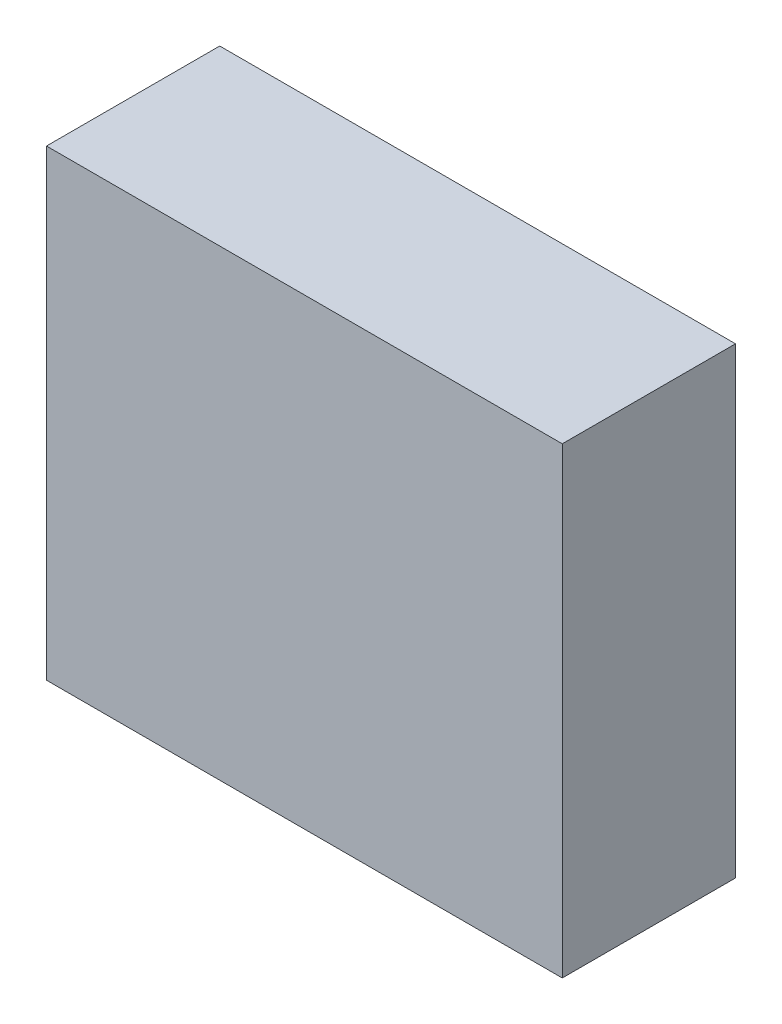
ISO-10303-21;
HEADER;
FILE_DESCRIPTION(('STEP AP214'),'2;1');
FILE_NAME('part.step','',(''),(''),'','','');
FILE_SCHEMA(('AUTOMOTIVE_DESIGN { 1 0 10303 214 1 1 1 1 }'));
ENDSEC;
DATA;
#1=APPLICATION_CONTEXT('core data for automotive mechanical design processes');
#2=APPLICATION_PROTOCOL_DEFINITION('international standard','automotive_design',2000,#1);
#3=PRODUCT_CONTEXT('',#1,'mechanical');
#4=PRODUCT('Part','Part','',(#3));
#5=PRODUCT_RELATED_PRODUCT_CATEGORY('part','',(#4));
#6=PRODUCT_DEFINITION_FORMATION('','',#4);
#7=PRODUCT_DEFINITION_CONTEXT('part definition',#1,'design');
#8=PRODUCT_DEFINITION('design','',#6,#7);
#9=PRODUCT_DEFINITION_SHAPE('','',#8);
#10=(LENGTH_UNIT() NAMED_UNIT(*) SI_UNIT(.MILLI.,.METRE.));
#11=(NAMED_UNIT(*) PLANE_ANGLE_UNIT() SI_UNIT($,.RADIAN.));
#12=(NAMED_UNIT(*) SI_UNIT($,.STERADIAN.) SOLID_ANGLE_UNIT());
#13=UNCERTAINTY_MEASURE_WITH_UNIT(LENGTH_MEASURE(1.E-05),#10,'distance_accuracy_value','');
#14=(GEOMETRIC_REPRESENTATION_CONTEXT(3) GLOBAL_UNCERTAINTY_ASSIGNED_CONTEXT((#13)) GLOBAL_UNIT_ASSIGNED_CONTEXT((#10,
#11,#12)) REPRESENTATION_CONTEXT('',''));
#15=CARTESIAN_POINT('',(0.,0.,0.));
#16=DIRECTION('',(0.,0.,1.));
#17=DIRECTION('',(1.,0.,0.));
#18=AXIS2_PLACEMENT_3D('',#15,#16,#17);
#19=CARTESIAN_POINT('',(-1.4888,-1.182,1.));
#20=DIRECTION('',(1.,0.,0.));
#21=DIRECTION('',(0.,0.,-1.));
#22=AXIS2_PLACEMENT_3D('',#19,#20,#21);
#23=PLANE('',#22);
#24=DIRECTION('',(0.,-1.,0.));
#25=VECTOR('',#24,1.);
#26=CARTESIAN_POINT('',(-1.4888,-1.182,0.));
#27=LINE('',#26,#25);
#28=CARTESIAN_POINT('',(-1.4888,1.4888,0.));
#29=VERTEX_POINT('',#28);
#30=CARTESIAN_POINT('',(-1.4888,-1.182,0.));
#31=VERTEX_POINT('',#30);
#32=EDGE_CURVE('E95',#29,#31,#27,.T.);
#33=ORIENTED_EDGE('',*,*,#32,.T.);
#34=DIRECTION('',(0.,0.,-1.));
#35=VECTOR('',#34,1.);
#36=CARTESIAN_POINT('',(-1.4888,-1.182,1.));
#37=LINE('',#36,#35);
#38=CARTESIAN_POINT('',(-1.4888,-1.182,1.));
#39=VERTEX_POINT('',#38);
#40=EDGE_CURVE('E11',#39,#31,#37,.T.);
#41=ORIENTED_EDGE('',*,*,#40,.F.);
#42=DIRECTION('',(0.,-1.,0.));
#43=VECTOR('',#42,1.);
#44=CARTESIAN_POINT('',(-1.4888,-1.182,1.));
#45=LINE('',#44,#43);
#46=CARTESIAN_POINT('',(-1.4888,1.4888,1.));
#47=VERTEX_POINT('',#46);
#48=EDGE_CURVE('E83',#47,#39,#45,.T.);
#49=ORIENTED_EDGE('',*,*,#48,.F.);
#50=DIRECTION('',(0.,0.,-1.));
#51=VECTOR('',#50,1.);
#52=CARTESIAN_POINT('',(-1.4888,1.4888,1.));
#53=LINE('',#52,#51);
#54=EDGE_CURVE('E91',#47,#29,#53,.T.);
#55=ORIENTED_EDGE('',*,*,#54,.T.);
#56=EDGE_LOOP('',(#33,#41,#49,#55));
#57=FACE_BOUND('',#56,.T.);
#58=ADVANCED_FACE('F32',(#57),#23,.F.);
#59=CARTESIAN_POINT('',(1.4888,-1.182,1.));
#60=DIRECTION('',(0.,1.,0.));
#61=DIRECTION('',(0.,0.,1.));
#62=AXIS2_PLACEMENT_3D('',#59,#60,#61);
#63=PLANE('',#62);
#64=DIRECTION('',(1.,0.,0.));
#65=VECTOR('',#64,1.);
#66=CARTESIAN_POINT('',(1.4888,-1.182,0.));
#67=LINE('',#66,#65);
#68=CARTESIAN_POINT('',(1.4888,-1.182,0.));
#69=VERTEX_POINT('',#68);
#70=EDGE_CURVE('E87',#31,#69,#67,.T.);
#71=ORIENTED_EDGE('',*,*,#70,.T.);
#72=DIRECTION('',(0.,0.,-1.));
#73=VECTOR('',#72,1.);
#74=CARTESIAN_POINT('',(1.4888,-1.182,1.));
#75=LINE('',#74,#73);
#76=CARTESIAN_POINT('',(1.4888,-1.182,1.));
#77=VERTEX_POINT('',#76);
#78=EDGE_CURVE('E40',#77,#69,#75,.T.);
#79=ORIENTED_EDGE('',*,*,#78,.F.);
#80=DIRECTION('',(1.,0.,0.));
#81=VECTOR('',#80,1.);
#82=CARTESIAN_POINT('',(1.4888,-1.182,1.));
#83=LINE('',#82,#81);
#84=EDGE_CURVE('E78',#39,#77,#83,.T.);
#85=ORIENTED_EDGE('',*,*,#84,.F.);
#86=ORIENTED_EDGE('',*,*,#40,.T.);
#87=EDGE_LOOP('',(#71,#79,#85,#86));
#88=FACE_BOUND('',#87,.T.);
#89=ADVANCED_FACE('F86',(#88),#63,.F.);
#90=CARTESIAN_POINT('',(1.4888,1.4888,1.));
#91=DIRECTION('',(-1.,0.,0.));
#92=DIRECTION('',(0.,0.,1.));
#93=AXIS2_PLACEMENT_3D('',#90,#91,#92);
#94=PLANE('',#93);
#95=DIRECTION('',(0.,1.,0.));
#96=VECTOR('',#95,1.);
#97=CARTESIAN_POINT('',(1.4888,1.4888,0.));
#98=LINE('',#97,#96);
#99=CARTESIAN_POINT('',(1.4888,1.4888,0.));
#100=VERTEX_POINT('',#99);
#101=EDGE_CURVE('E65',#69,#100,#98,.T.);
#102=ORIENTED_EDGE('',*,*,#101,.T.);
#103=DIRECTION('',(0.,0.,-1.));
#104=VECTOR('',#103,1.);
#105=CARTESIAN_POINT('',(1.4888,1.4888,1.));
#106=LINE('',#105,#104);
#107=CARTESIAN_POINT('',(1.4888,1.4888,1.));
#108=VERTEX_POINT('',#107);
#109=EDGE_CURVE('E88',#108,#100,#106,.T.);
#110=ORIENTED_EDGE('',*,*,#109,.F.);
#111=DIRECTION('',(0.,1.,0.));
#112=VECTOR('',#111,1.);
#113=CARTESIAN_POINT('',(1.4888,1.4888,1.));
#114=LINE('',#113,#112);
#115=EDGE_CURVE('E81',#77,#108,#114,.T.);
#116=ORIENTED_EDGE('',*,*,#115,.F.);
#117=ORIENTED_EDGE('',*,*,#78,.T.);
#118=EDGE_LOOP('',(#102,#110,#116,#117));
#119=FACE_BOUND('',#118,.T.);
#120=ADVANCED_FACE('F89',(#119),#94,.F.);
#121=CARTESIAN_POINT('',(-1.4888,1.4888,1.));
#122=DIRECTION('',(0.,-1.,0.));
#123=DIRECTION('',(0.,0.,-1.));
#124=AXIS2_PLACEMENT_3D('',#121,#122,#123);
#125=PLANE('',#124);
#126=DIRECTION('',(-1.,0.,0.));
#127=VECTOR('',#126,1.);
#128=CARTESIAN_POINT('',(-1.4888,1.4888,0.));
#129=LINE('',#128,#127);
#130=EDGE_CURVE('E71',#100,#29,#129,.T.);
#131=ORIENTED_EDGE('',*,*,#130,.T.);
#132=ORIENTED_EDGE('',*,*,#54,.F.);
#133=DIRECTION('',(-1.,0.,0.));
#134=VECTOR('',#133,1.);
#135=CARTESIAN_POINT('',(-1.4888,1.4888,1.));
#136=LINE('',#135,#134);
#137=EDGE_CURVE('E48',#108,#47,#136,.T.);
#138=ORIENTED_EDGE('',*,*,#137,.F.);
#139=ORIENTED_EDGE('',*,*,#109,.T.);
#140=EDGE_LOOP('',(#131,#132,#138,#139));
#141=FACE_BOUND('',#140,.T.);
#142=ADVANCED_FACE('F102',(#141),#125,.F.);
#143=CARTESIAN_POINT('',(0.,0.,1.));
#144=DIRECTION('',(0.,0.,-1.));
#145=DIRECTION('',(-1.,0.,0.));
#146=AXIS2_PLACEMENT_3D('',#143,#144,#145);
#147=PLANE('',#146);
#148=ORIENTED_EDGE('',*,*,#48,.T.);
#149=ORIENTED_EDGE('',*,*,#84,.T.);
#150=ORIENTED_EDGE('',*,*,#115,.T.);
#151=ORIENTED_EDGE('',*,*,#137,.T.);
#152=EDGE_LOOP('',(#148,#149,#150,#151));
#153=FACE_BOUND('',#152,.T.);
#154=ADVANCED_FACE('F79',(#153),#147,.F.);
#155=CARTESIAN_POINT('',(0.,0.,0.));
#156=DIRECTION('',(0.,0.,-1.));
#157=DIRECTION('',(-1.,0.,0.));
#158=AXIS2_PLACEMENT_3D('',#155,#156,#157);
#159=PLANE('',#158);
#160=ORIENTED_EDGE('',*,*,#32,.F.);
#161=ORIENTED_EDGE('',*,*,#130,.F.);
#162=ORIENTED_EDGE('',*,*,#101,.F.);
#163=ORIENTED_EDGE('',*,*,#70,.F.);
#164=EDGE_LOOP('',(#160,#161,#162,#163));
#165=FACE_BOUND('',#164,.T.);
#166=ADVANCED_FACE('F105',(#165),#159,.T.);
#167=CLOSED_SHELL('',(#58,#89,#120,#142,#154,#166));
#168=MANIFOLD_SOLID_BREP('B2',#167);
#169=ADVANCED_BREP_SHAPE_REPRESENTATION('',(#18,#168),#14);
#170=SHAPE_DEFINITION_REPRESENTATION(#9,#169);
ENDSEC;
END-ISO-10303-21;
